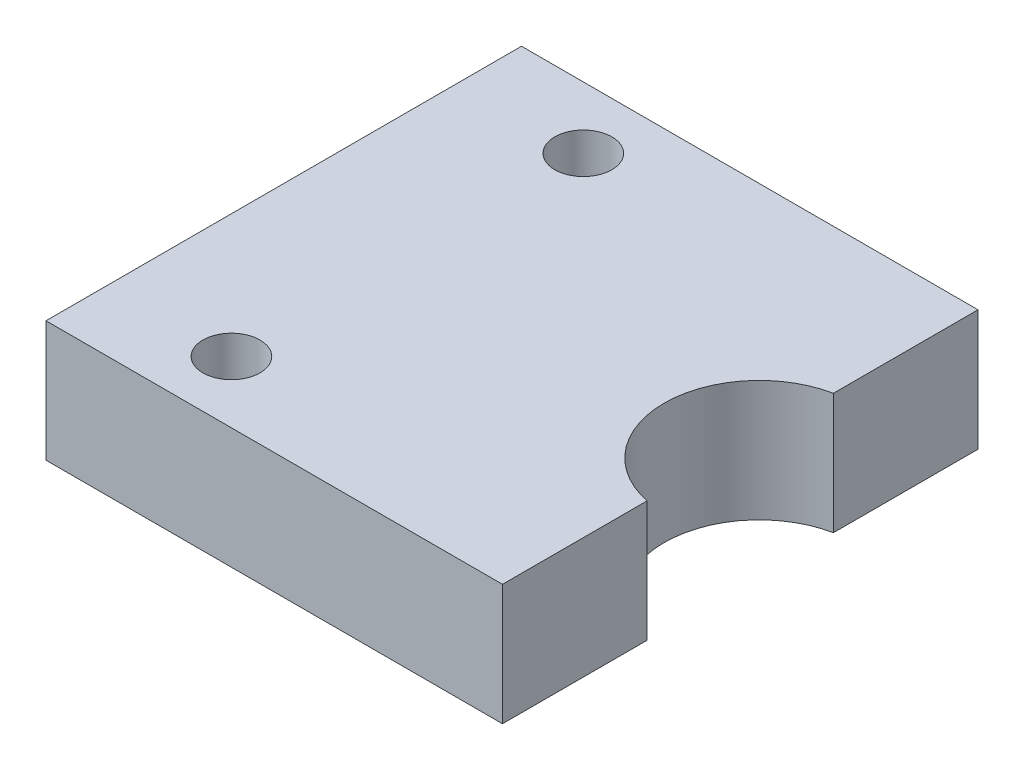
ISO-10303-21;
HEADER;
FILE_DESCRIPTION(('STEP AP214'),'2;1');
FILE_NAME('part.step','',(''),(''),'','','');
FILE_SCHEMA(('AUTOMOTIVE_DESIGN { 1 0 10303 214 1 1 1 1 }'));
ENDSEC;
DATA;
#1=APPLICATION_CONTEXT('core data for automotive mechanical design processes');
#2=APPLICATION_PROTOCOL_DEFINITION('international standard','automotive_design',2000,#1);
#3=PRODUCT_CONTEXT('',#1,'mechanical');
#4=PRODUCT('Part','Part','',(#3));
#5=PRODUCT_RELATED_PRODUCT_CATEGORY('part','',(#4));
#6=PRODUCT_DEFINITION_FORMATION('','',#4);
#7=PRODUCT_DEFINITION_CONTEXT('part definition',#1,'design');
#8=PRODUCT_DEFINITION('design','',#6,#7);
#9=PRODUCT_DEFINITION_SHAPE('','',#8);
#10=(LENGTH_UNIT() NAMED_UNIT(*) SI_UNIT(.MILLI.,.METRE.));
#11=(NAMED_UNIT(*) PLANE_ANGLE_UNIT() SI_UNIT($,.RADIAN.));
#12=(NAMED_UNIT(*) SI_UNIT($,.STERADIAN.) SOLID_ANGLE_UNIT());
#13=UNCERTAINTY_MEASURE_WITH_UNIT(LENGTH_MEASURE(1.E-05),#10,'distance_accuracy_value','');
#14=(GEOMETRIC_REPRESENTATION_CONTEXT(3) GLOBAL_UNCERTAINTY_ASSIGNED_CONTEXT((#13)) GLOBAL_UNIT_ASSIGNED_CONTEXT((#10,
#11,#12)) REPRESENTATION_CONTEXT('',''));
#15=CARTESIAN_POINT('',(0.,0.,0.));
#16=DIRECTION('',(0.,0.,1.));
#17=DIRECTION('',(1.,0.,0.));
#18=AXIS2_PLACEMENT_3D('',#15,#16,#17);
#19=CARTESIAN_POINT('',(0.,12.7,0.));
#20=DIRECTION('',(0.,1.,0.));
#21=DIRECTION('',(0.,0.,1.));
#22=AXIS2_PLACEMENT_3D('',#19,#20,#21);
#23=PLANE('',#22);
#24=CARTESIAN_POINT('',(-37.,12.7,18.5));
#25=DIRECTION('',(0.,1.,0.));
#26=DIRECTION('',(0.,0.,1.));
#27=AXIS2_PLACEMENT_3D('',#24,#25,#26);
#28=CIRCLE('',#27,3.);
#29=CARTESIAN_POINT('',(-37.,12.7,21.5));
#30=VERTEX_POINT('',#29);
#31=EDGE_CURVE('E136',#30,#30,#28,.T.);
#32=ORIENTED_EDGE('',*,*,#31,.F.);
#33=EDGE_LOOP('',(#32));
#34=FACE_BOUND('',#33,.T.);
#35=DIRECTION('',(1.,0.,0.));
#36=VECTOR('',#35,1.);
#37=CARTESIAN_POINT('',(-2.00000000000001,12.7,25.));
#38=LINE('',#37,#36);
#39=CARTESIAN_POINT('',(-50.,12.7,25.));
#40=VERTEX_POINT('',#39);
#41=CARTESIAN_POINT('',(-2.00000000000001,12.7,25.));
#42=VERTEX_POINT('',#41);
#43=EDGE_CURVE('E148',#40,#42,#38,.T.);
#44=ORIENTED_EDGE('',*,*,#43,.T.);
#45=DIRECTION('',(0.,0.,-1.));
#46=VECTOR('',#45,1.);
#47=CARTESIAN_POINT('',(-2.00000000000001,12.7,25.));
#48=LINE('',#47,#46);
#49=CARTESIAN_POINT('',(-2.00000000000001,12.7,9.79795897113272));
#50=VERTEX_POINT('',#49);
#51=EDGE_CURVE('E96',#42,#50,#48,.T.);
#52=ORIENTED_EDGE('',*,*,#51,.T.);
#53=CARTESIAN_POINT('',(0.,12.7,0.));
#54=DIRECTION('',(0.,-1.,0.));
#55=DIRECTION('',(0.,0.,1.));
#56=AXIS2_PLACEMENT_3D('',#53,#54,#55);
#57=CIRCLE('',#56,10.);
#58=CARTESIAN_POINT('',(-2.00000000000001,12.7,-9.7979589711327));
#59=VERTEX_POINT('',#58);
#60=EDGE_CURVE('E109',#50,#59,#57,.T.);
#61=ORIENTED_EDGE('',*,*,#60,.T.);
#62=DIRECTION('',(0.,0.,-1.));
#63=VECTOR('',#62,1.);
#64=CARTESIAN_POINT('',(-2.00000000000001,12.7,-9.7979589711327));
#65=LINE('',#64,#63);
#66=CARTESIAN_POINT('',(-2.00000000000001,12.7,-25.));
#67=VERTEX_POINT('',#66);
#68=EDGE_CURVE('E103',#59,#67,#65,.T.);
#69=ORIENTED_EDGE('',*,*,#68,.T.);
#70=DIRECTION('',(-1.,0.,0.));
#71=VECTOR('',#70,1.);
#72=CARTESIAN_POINT('',(-2.00000000000001,12.7,-25.));
#73=LINE('',#72,#71);
#74=CARTESIAN_POINT('',(-50.,12.7,-25.));
#75=VERTEX_POINT('',#74);
#76=EDGE_CURVE('E107',#67,#75,#73,.T.);
#77=ORIENTED_EDGE('',*,*,#76,.T.);
#78=DIRECTION('',(0.,0.,1.));
#79=VECTOR('',#78,1.);
#80=CARTESIAN_POINT('',(-50.,12.7,-25.));
#81=LINE('',#80,#79);
#82=EDGE_CURVE('E59',#75,#40,#81,.T.);
#83=ORIENTED_EDGE('',*,*,#82,.T.);
#84=EDGE_LOOP('',(#44,#52,#61,#69,#77,#83));
#85=FACE_BOUND('',#84,.T.);
#86=CARTESIAN_POINT('',(-37.,12.7,-18.5));
#87=DIRECTION('',(0.,1.,0.));
#88=DIRECTION('',(0.,0.,1.));
#89=AXIS2_PLACEMENT_3D('',#86,#87,#88);
#90=CIRCLE('',#89,3.);
#91=CARTESIAN_POINT('',(-37.,12.7,-15.5));
#92=VERTEX_POINT('',#91);
#93=EDGE_CURVE('E194',#92,#92,#90,.T.);
#94=ORIENTED_EDGE('',*,*,#93,.F.);
#95=EDGE_LOOP('',(#94));
#96=FACE_BOUND('',#95,.T.);
#97=ADVANCED_FACE('F41',(#34,#85,#96),#23,.T.);
#98=CARTESIAN_POINT('',(0.,0.,0.));
#99=DIRECTION('',(0.,1.,0.));
#100=DIRECTION('',(0.,0.,1.));
#101=AXIS2_PLACEMENT_3D('',#98,#99,#100);
#102=PLANE('',#101);
#103=DIRECTION('',(1.,0.,0.));
#104=VECTOR('',#103,1.);
#105=CARTESIAN_POINT('',(-2.00000000000001,0.,25.));
#106=LINE('',#105,#104);
#107=CARTESIAN_POINT('',(-50.,0.,25.));
#108=VERTEX_POINT('',#107);
#109=CARTESIAN_POINT('',(-2.00000000000001,0.,25.));
#110=VERTEX_POINT('',#109);
#111=EDGE_CURVE('E131',#108,#110,#106,.T.);
#112=ORIENTED_EDGE('',*,*,#111,.F.);
#113=DIRECTION('',(0.,0.,1.));
#114=VECTOR('',#113,1.);
#115=CARTESIAN_POINT('',(-50.,0.,-25.));
#116=LINE('',#115,#114);
#117=CARTESIAN_POINT('',(-50.,0.,-25.));
#118=VERTEX_POINT('',#117);
#119=EDGE_CURVE('E88',#118,#108,#116,.T.);
#120=ORIENTED_EDGE('',*,*,#119,.F.);
#121=DIRECTION('',(-1.,0.,0.));
#122=VECTOR('',#121,1.);
#123=CARTESIAN_POINT('',(-2.00000000000001,0.,-25.));
#124=LINE('',#123,#122);
#125=CARTESIAN_POINT('',(-2.00000000000001,0.,-25.));
#126=VERTEX_POINT('',#125);
#127=EDGE_CURVE('E82',#126,#118,#124,.T.);
#128=ORIENTED_EDGE('',*,*,#127,.F.);
#129=DIRECTION('',(0.,0.,-1.));
#130=VECTOR('',#129,1.);
#131=CARTESIAN_POINT('',(-2.00000000000001,0.,-9.7979589711327));
#132=LINE('',#131,#130);
#133=CARTESIAN_POINT('',(-2.00000000000001,0.,-9.7979589711327));
#134=VERTEX_POINT('',#133);
#135=EDGE_CURVE('E118',#134,#126,#132,.T.);
#136=ORIENTED_EDGE('',*,*,#135,.F.);
#137=CARTESIAN_POINT('',(0.,0.,0.));
#138=DIRECTION('',(0.,-1.,0.));
#139=DIRECTION('',(0.,0.,1.));
#140=AXIS2_PLACEMENT_3D('',#137,#138,#139);
#141=CIRCLE('',#140,10.);
#142=CARTESIAN_POINT('',(-2.00000000000001,0.,9.79795897113272));
#143=VERTEX_POINT('',#142);
#144=EDGE_CURVE('E139',#143,#134,#141,.T.);
#145=ORIENTED_EDGE('',*,*,#144,.F.);
#146=DIRECTION('',(0.,0.,-1.));
#147=VECTOR('',#146,1.);
#148=CARTESIAN_POINT('',(-2.00000000000001,0.,25.));
#149=LINE('',#148,#147);
#150=EDGE_CURVE('E135',#110,#143,#149,.T.);
#151=ORIENTED_EDGE('',*,*,#150,.F.);
#152=EDGE_LOOP('',(#112,#120,#128,#136,#145,#151));
#153=FACE_BOUND('',#152,.T.);
#154=CARTESIAN_POINT('',(-37.,0.,18.5));
#155=DIRECTION('',(0.,1.,0.));
#156=DIRECTION('',(0.,0.,1.));
#157=AXIS2_PLACEMENT_3D('',#154,#155,#156);
#158=CIRCLE('',#157,3.);
#159=CARTESIAN_POINT('',(-37.,0.,21.5));
#160=VERTEX_POINT('',#159);
#161=EDGE_CURVE('E202',#160,#160,#158,.T.);
#162=ORIENTED_EDGE('',*,*,#161,.T.);
#163=EDGE_LOOP('',(#162));
#164=FACE_BOUND('',#163,.T.);
#165=CARTESIAN_POINT('',(-37.,0.,-18.5));
#166=DIRECTION('',(0.,1.,0.));
#167=DIRECTION('',(0.,0.,1.));
#168=AXIS2_PLACEMENT_3D('',#165,#166,#167);
#169=CIRCLE('',#168,3.);
#170=CARTESIAN_POINT('',(-37.,0.,-15.5));
#171=VERTEX_POINT('',#170);
#172=EDGE_CURVE('E197',#171,#171,#169,.T.);
#173=ORIENTED_EDGE('',*,*,#172,.T.);
#174=EDGE_LOOP('',(#173));
#175=FACE_BOUND('',#174,.T.);
#176=ADVANCED_FACE('F161',(#153,#164,#175),#102,.F.);
#177=CARTESIAN_POINT('',(-2.00000000000001,12.7,25.));
#178=DIRECTION('',(0.,0.,-1.));
#179=DIRECTION('',(-1.,0.,0.));
#180=AXIS2_PLACEMENT_3D('',#177,#178,#179);
#181=PLANE('',#180);
#182=ORIENTED_EDGE('',*,*,#111,.T.);
#183=DIRECTION('',(0.,-1.,0.));
#184=VECTOR('',#183,1.);
#185=CARTESIAN_POINT('',(-2.00000000000001,12.7,25.));
#186=LINE('',#185,#184);
#187=EDGE_CURVE('E11',#42,#110,#186,.T.);
#188=ORIENTED_EDGE('',*,*,#187,.F.);
#189=ORIENTED_EDGE('',*,*,#43,.F.);
#190=DIRECTION('',(0.,-1.,0.));
#191=VECTOR('',#190,1.);
#192=CARTESIAN_POINT('',(-50.,12.7,25.));
#193=LINE('',#192,#191);
#194=EDGE_CURVE('E127',#40,#108,#193,.T.);
#195=ORIENTED_EDGE('',*,*,#194,.T.);
#196=EDGE_LOOP('',(#182,#188,#189,#195));
#197=FACE_BOUND('',#196,.T.);
#198=ADVANCED_FACE('F43',(#197),#181,.F.);
#199=CARTESIAN_POINT('',(-2.00000000000001,12.7,25.));
#200=DIRECTION('',(-1.,0.,0.));
#201=DIRECTION('',(0.,0.,1.));
#202=AXIS2_PLACEMENT_3D('',#199,#200,#201);
#203=PLANE('',#202);
#204=ORIENTED_EDGE('',*,*,#150,.T.);
#205=DIRECTION('',(0.,-1.,0.));
#206=VECTOR('',#205,1.);
#207=CARTESIAN_POINT('',(-2.00000000000001,12.7,9.79795897113272));
#208=LINE('',#207,#206);
#209=EDGE_CURVE('E51',#50,#143,#208,.T.);
#210=ORIENTED_EDGE('',*,*,#209,.F.);
#211=ORIENTED_EDGE('',*,*,#51,.F.);
#212=ORIENTED_EDGE('',*,*,#187,.T.);
#213=EDGE_LOOP('',(#204,#210,#211,#212));
#214=FACE_BOUND('',#213,.T.);
#215=ADVANCED_FACE('F248',(#214),#203,.F.);
#216=CARTESIAN_POINT('',(0.,12.7,0.));
#217=DIRECTION('',(0.,-1.,0.));
#218=DIRECTION('',(0.,0.,-1.));
#219=AXIS2_PLACEMENT_3D('',#216,#217,#218);
#220=CYLINDRICAL_SURFACE('',#219,10.);
#221=ORIENTED_EDGE('',*,*,#144,.T.);
#222=DIRECTION('',(0.,-1.,0.));
#223=VECTOR('',#222,1.);
#224=CARTESIAN_POINT('',(-2.00000000000001,12.7,-9.7979589711327));
#225=LINE('',#224,#223);
#226=EDGE_CURVE('E120',#59,#134,#225,.T.);
#227=ORIENTED_EDGE('',*,*,#226,.F.);
#228=ORIENTED_EDGE('',*,*,#60,.F.);
#229=ORIENTED_EDGE('',*,*,#209,.T.);
#230=EDGE_LOOP('',(#221,#227,#228,#229));
#231=FACE_BOUND('',#230,.T.);
#232=ADVANCED_FACE('F158',(#231),#220,.F.);
#233=CARTESIAN_POINT('',(-2.00000000000001,12.7,-9.7979589711327));
#234=DIRECTION('',(-1.,0.,0.));
#235=DIRECTION('',(0.,0.,1.));
#236=AXIS2_PLACEMENT_3D('',#233,#234,#235);
#237=PLANE('',#236);
#238=ORIENTED_EDGE('',*,*,#135,.T.);
#239=DIRECTION('',(0.,-1.,0.));
#240=VECTOR('',#239,1.);
#241=CARTESIAN_POINT('',(-2.00000000000001,12.7,-25.));
#242=LINE('',#241,#240);
#243=EDGE_CURVE('E115',#67,#126,#242,.T.);
#244=ORIENTED_EDGE('',*,*,#243,.F.);
#245=ORIENTED_EDGE('',*,*,#68,.F.);
#246=ORIENTED_EDGE('',*,*,#226,.T.);
#247=EDGE_LOOP('',(#238,#244,#245,#246));
#248=FACE_BOUND('',#247,.T.);
#249=ADVANCED_FACE('F116',(#248),#237,.F.);
#250=CARTESIAN_POINT('',(-2.00000000000001,12.7,-25.));
#251=DIRECTION('',(0.,0.,1.));
#252=DIRECTION('',(1.,0.,0.));
#253=AXIS2_PLACEMENT_3D('',#250,#251,#252);
#254=PLANE('',#253);
#255=ORIENTED_EDGE('',*,*,#127,.T.);
#256=DIRECTION('',(0.,-1.,0.));
#257=VECTOR('',#256,1.);
#258=CARTESIAN_POINT('',(-50.,12.7,-25.));
#259=LINE('',#258,#257);
#260=EDGE_CURVE('E121',#75,#118,#259,.T.);
#261=ORIENTED_EDGE('',*,*,#260,.F.);
#262=ORIENTED_EDGE('',*,*,#76,.F.);
#263=ORIENTED_EDGE('',*,*,#243,.T.);
#264=EDGE_LOOP('',(#255,#261,#262,#263));
#265=FACE_BOUND('',#264,.T.);
#266=ADVANCED_FACE('F123',(#265),#254,.F.);
#267=CARTESIAN_POINT('',(-50.,12.7,-25.));
#268=DIRECTION('',(1.,0.,0.));
#269=DIRECTION('',(0.,0.,-1.));
#270=AXIS2_PLACEMENT_3D('',#267,#268,#269);
#271=PLANE('',#270);
#272=ORIENTED_EDGE('',*,*,#119,.T.);
#273=ORIENTED_EDGE('',*,*,#194,.F.);
#274=ORIENTED_EDGE('',*,*,#82,.F.);
#275=ORIENTED_EDGE('',*,*,#260,.T.);
#276=EDGE_LOOP('',(#272,#273,#274,#275));
#277=FACE_BOUND('',#276,.T.);
#278=ADVANCED_FACE('F166',(#277),#271,.F.);
#279=CARTESIAN_POINT('',(-37.,12.7,18.5));
#280=DIRECTION('',(0.,-1.,0.));
#281=DIRECTION('',(0.,0.,-1.));
#282=AXIS2_PLACEMENT_3D('',#279,#280,#281);
#283=CYLINDRICAL_SURFACE('',#282,3.);
#284=ORIENTED_EDGE('',*,*,#31,.T.);
#285=EDGE_LOOP('',(#284));
#286=FACE_BOUND('',#285,.T.);
#287=ORIENTED_EDGE('',*,*,#161,.F.);
#288=EDGE_LOOP('',(#287));
#289=FACE_BOUND('',#288,.T.);
#290=ADVANCED_FACE('F168',(#286,#289),#283,.F.);
#291=CARTESIAN_POINT('',(-37.,12.7,-18.5));
#292=DIRECTION('',(0.,-1.,0.));
#293=DIRECTION('',(0.,0.,-1.));
#294=AXIS2_PLACEMENT_3D('',#291,#292,#293);
#295=CYLINDRICAL_SURFACE('',#294,3.);
#296=ORIENTED_EDGE('',*,*,#93,.T.);
#297=EDGE_LOOP('',(#296));
#298=FACE_BOUND('',#297,.T.);
#299=ORIENTED_EDGE('',*,*,#172,.F.);
#300=EDGE_LOOP('',(#299));
#301=FACE_BOUND('',#300,.T.);
#302=ADVANCED_FACE('F174',(#298,#301),#295,.F.);
#303=CLOSED_SHELL('',(#97,#176,#198,#215,#232,#249,#266,#278,#290,#302));
#304=MANIFOLD_SOLID_BREP('B2',#303);
#305=ADVANCED_BREP_SHAPE_REPRESENTATION('',(#18,#304),#14);
#306=SHAPE_DEFINITION_REPRESENTATION(#9,#305);
ENDSEC;
END-ISO-10303-21;
